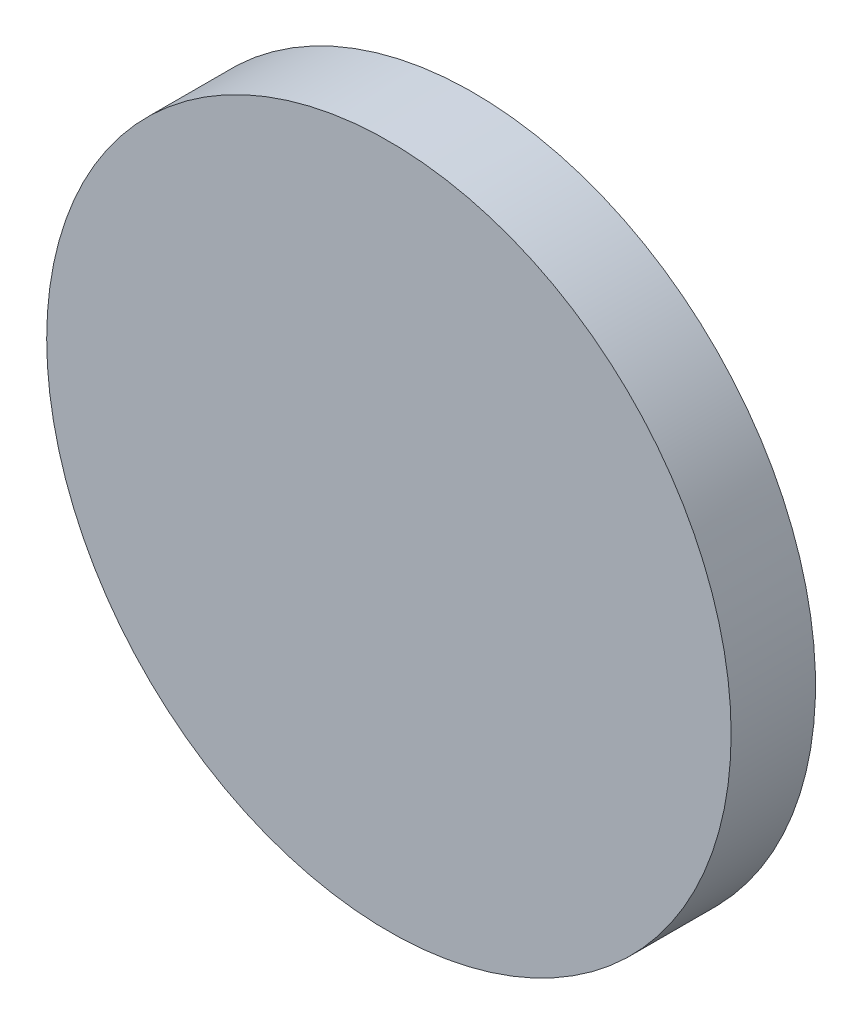
ISO-10303-21;
HEADER;
FILE_DESCRIPTION(('STEP AP214'),'2;1');
FILE_NAME('part.step','',(''),(''),'','','');
FILE_SCHEMA(('AUTOMOTIVE_DESIGN { 1 0 10303 214 1 1 1 1 }'));
ENDSEC;
DATA;
#1=APPLICATION_CONTEXT('core data for automotive mechanical design processes');
#2=APPLICATION_PROTOCOL_DEFINITION('international standard','automotive_design',2000,#1);
#3=PRODUCT_CONTEXT('',#1,'mechanical');
#4=PRODUCT('Part','Part','',(#3));
#5=PRODUCT_RELATED_PRODUCT_CATEGORY('part','',(#4));
#6=PRODUCT_DEFINITION_FORMATION('','',#4);
#7=PRODUCT_DEFINITION_CONTEXT('part definition',#1,'design');
#8=PRODUCT_DEFINITION('design','',#6,#7);
#9=PRODUCT_DEFINITION_SHAPE('','',#8);
#10=(LENGTH_UNIT() NAMED_UNIT(*) SI_UNIT(.MILLI.,.METRE.));
#11=(NAMED_UNIT(*) PLANE_ANGLE_UNIT() SI_UNIT($,.RADIAN.));
#12=(NAMED_UNIT(*) SI_UNIT($,.STERADIAN.) SOLID_ANGLE_UNIT());
#13=UNCERTAINTY_MEASURE_WITH_UNIT(LENGTH_MEASURE(1.E-05),#10,'distance_accuracy_value','');
#14=(GEOMETRIC_REPRESENTATION_CONTEXT(3) GLOBAL_UNCERTAINTY_ASSIGNED_CONTEXT((#13)) GLOBAL_UNIT_ASSIGNED_CONTEXT((#10,
#11,#12)) REPRESENTATION_CONTEXT('',''));
#15=CARTESIAN_POINT('',(0.,0.,0.));
#16=DIRECTION('',(0.,0.,1.));
#17=DIRECTION('',(1.,0.,0.));
#18=AXIS2_PLACEMENT_3D('',#15,#16,#17);
#19=CARTESIAN_POINT('',(0.,0.,15.));
#20=DIRECTION('',(0.,0.,1.));
#21=DIRECTION('',(1.,0.,0.));
#22=AXIS2_PLACEMENT_3D('',#19,#20,#21);
#23=PLANE('',#22);
#24=CARTESIAN_POINT('',(0.,0.,15.));
#25=DIRECTION('',(0.,0.,1.));
#26=DIRECTION('',(1.,0.,0.));
#27=AXIS2_PLACEMENT_3D('',#24,#25,#26);
#28=CIRCLE('',#27,25.5);
#29=CARTESIAN_POINT('',(25.5,0.,15.));
#30=VERTEX_POINT('',#29);
#31=EDGE_CURVE('E10',#30,#30,#28,.T.);
#32=ORIENTED_EDGE('',*,*,#31,.T.);
#33=EDGE_LOOP('',(#32));
#34=FACE_BOUND('',#33,.T.);
#35=CARTESIAN_POINT('',(0.,0.,15.));
#36=DIRECTION('',(0.,0.,1.));
#37=DIRECTION('',(1.,0.,0.));
#38=AXIS2_PLACEMENT_3D('',#35,#36,#37);
#39=CIRCLE('',#38,29.5);
#40=CARTESIAN_POINT('',(29.5,0.,15.));
#41=VERTEX_POINT('',#40);
#42=EDGE_CURVE('E53',#41,#41,#39,.T.);
#43=ORIENTED_EDGE('',*,*,#42,.F.);
#44=EDGE_LOOP('',(#43));
#45=FACE_BOUND('',#44,.T.);
#46=ADVANCED_FACE('F33',(#34,#45),#23,.F.);
#47=CARTESIAN_POINT('',(0.,0.,15.));
#48=DIRECTION('',(0.,0.,-1.));
#49=DIRECTION('',(-1.,0.,0.));
#50=AXIS2_PLACEMENT_3D('',#47,#48,#49);
#51=CYLINDRICAL_SURFACE('',#50,25.5);
#52=ORIENTED_EDGE('',*,*,#31,.F.);
#53=EDGE_LOOP('',(#52));
#54=FACE_BOUND('',#53,.T.);
#55=CARTESIAN_POINT('',(0.,0.,8.));
#56=DIRECTION('',(0.,0.,-1.));
#57=DIRECTION('',(-1.,0.,0.));
#58=AXIS2_PLACEMENT_3D('',#55,#56,#57);
#59=CIRCLE('',#58,25.5);
#60=CARTESIAN_POINT('',(-25.5,0.,8.));
#61=VERTEX_POINT('',#60);
#62=EDGE_CURVE('E41',#61,#61,#59,.T.);
#63=ORIENTED_EDGE('',*,*,#62,.F.);
#64=EDGE_LOOP('',(#63));
#65=FACE_BOUND('',#64,.T.);
#66=ADVANCED_FACE('F35',(#54,#65),#51,.T.);
#67=CARTESIAN_POINT('',(0.,0.,15.));
#68=DIRECTION('',(0.,0.,-1.));
#69=DIRECTION('',(-1.,0.,0.));
#70=AXIS2_PLACEMENT_3D('',#67,#68,#69);
#71=CYLINDRICAL_SURFACE('',#70,23.5);
#72=CARTESIAN_POINT('',(0.,0.,15.));
#73=DIRECTION('',(0.,0.,1.));
#74=DIRECTION('',(1.,0.,0.));
#75=AXIS2_PLACEMENT_3D('',#72,#73,#74);
#76=CIRCLE('',#75,23.5);
#77=CARTESIAN_POINT('',(23.5,0.,15.));
#78=VERTEX_POINT('',#77);
#79=EDGE_CURVE('E47',#78,#78,#76,.T.);
#80=ORIENTED_EDGE('',*,*,#79,.T.);
#81=EDGE_LOOP('',(#80));
#82=FACE_BOUND('',#81,.T.);
#83=CARTESIAN_POINT('',(0.,0.,8.));
#84=DIRECTION('',(0.,0.,-1.));
#85=DIRECTION('',(-1.,0.,0.));
#86=AXIS2_PLACEMENT_3D('',#83,#84,#85);
#87=CIRCLE('',#86,23.5);
#88=CARTESIAN_POINT('',(-23.5,0.,8.));
#89=VERTEX_POINT('',#88);
#90=EDGE_CURVE('E37',#89,#89,#87,.T.);
#91=ORIENTED_EDGE('',*,*,#90,.T.);
#92=EDGE_LOOP('',(#91));
#93=FACE_BOUND('',#92,.T.);
#94=ADVANCED_FACE('F88',(#82,#93),#71,.F.);
#95=CARTESIAN_POINT('',(0.,0.,8.));
#96=DIRECTION('',(0.,0.,-1.));
#97=DIRECTION('',(-1.,0.,0.));
#98=AXIS2_PLACEMENT_3D('',#95,#96,#97);
#99=PLANE('',#98);
#100=ORIENTED_EDGE('',*,*,#90,.F.);
#101=EDGE_LOOP('',(#100));
#102=FACE_BOUND('',#101,.T.);
#103=ORIENTED_EDGE('',*,*,#62,.T.);
#104=EDGE_LOOP('',(#103));
#105=FACE_BOUND('',#104,.T.);
#106=ADVANCED_FACE('F93',(#102,#105),#99,.T.);
#107=ORIENTED_EDGE('',*,*,#79,.F.);
#108=EDGE_LOOP('',(#107));
#109=FACE_BOUND('',#108,.T.);
#110=ADVANCED_FACE('F82',(#109),#23,.F.);
#111=CARTESIAN_POINT('',(0.,0.,8.));
#112=DIRECTION('',(0.,0.,-1.));
#113=DIRECTION('',(-1.,0.,0.));
#114=AXIS2_PLACEMENT_3D('',#111,#112,#113);
#115=TOROIDAL_SURFACE('',#114,29.5,5.);
#116=CARTESIAN_POINT('',(0.,0.,13.));
#117=DIRECTION('',(0.,0.,-1.));
#118=DIRECTION('',(-1.,0.,0.));
#119=AXIS2_PLACEMENT_3D('',#116,#117,#118);
#120=CIRCLE('',#119,29.5);
#121=CARTESIAN_POINT('',(-29.5,0.,13.));
#122=VERTEX_POINT('',#121);
#123=EDGE_CURVE('E60',#122,#122,#120,.T.);
#124=ORIENTED_EDGE('',*,*,#123,.F.);
#125=EDGE_LOOP('',(#124));
#126=FACE_BOUND('',#125,.T.);
#127=CARTESIAN_POINT('',(0.,0.,8.));
#128=DIRECTION('',(0.,0.,-1.));
#129=DIRECTION('',(-1.,0.,0.));
#130=AXIS2_PLACEMENT_3D('',#127,#128,#129);
#131=CIRCLE('',#130,34.5);
#132=CARTESIAN_POINT('',(-34.5,0.,8.));
#133=VERTEX_POINT('',#132);
#134=EDGE_CURVE('E54',#133,#133,#131,.F.);
#135=ORIENTED_EDGE('',*,*,#134,.F.);
#136=EDGE_LOOP('',(#135));
#137=FACE_BOUND('',#136,.T.);
#138=ADVANCED_FACE('F92',(#126,#137),#115,.F.);
#139=CARTESIAN_POINT('',(0.,0.,15.));
#140=DIRECTION('',(0.,0.,-1.));
#141=DIRECTION('',(-1.,0.,0.));
#142=AXIS2_PLACEMENT_3D('',#139,#140,#141);
#143=CYLINDRICAL_SURFACE('',#142,29.5);
#144=ORIENTED_EDGE('',*,*,#123,.T.);
#145=EDGE_LOOP('',(#144));
#146=FACE_BOUND('',#145,.T.);
#147=ORIENTED_EDGE('',*,*,#42,.T.);
#148=EDGE_LOOP('',(#147));
#149=FACE_BOUND('',#148,.T.);
#150=ADVANCED_FACE('F99',(#146,#149),#143,.F.);
#151=CARTESIAN_POINT('',(0.,0.,8.));
#152=DIRECTION('',(0.,0.,-1.));
#153=DIRECTION('',(-1.,0.,0.));
#154=AXIS2_PLACEMENT_3D('',#151,#152,#153);
#155=PLANE('',#154);
#156=ORIENTED_EDGE('',*,*,#134,.T.);
#157=EDGE_LOOP('',(#156));
#158=FACE_BOUND('',#157,.T.);
#159=CARTESIAN_POINT('',(0.,0.,8.));
#160=DIRECTION('',(0.,0.,-1.));
#161=DIRECTION('',(-1.,0.,0.));
#162=AXIS2_PLACEMENT_3D('',#159,#160,#161);
#163=CIRCLE('',#162,36.5);
#164=CARTESIAN_POINT('',(-36.5,0.,8.));
#165=VERTEX_POINT('',#164);
#166=EDGE_CURVE('E57',#165,#165,#163,.T.);
#167=ORIENTED_EDGE('',*,*,#166,.T.);
#168=EDGE_LOOP('',(#167));
#169=FACE_BOUND('',#168,.T.);
#170=ADVANCED_FACE('F66',(#158,#169),#155,.T.);
#171=CARTESIAN_POINT('',(0.,0.,17.));
#172=DIRECTION('',(0.,0.,1.));
#173=DIRECTION('',(1.,0.,0.));
#174=AXIS2_PLACEMENT_3D('',#171,#172,#173);
#175=PLANE('',#174);
#176=CARTESIAN_POINT('',(0.,0.,17.));
#177=DIRECTION('',(0.,0.,1.));
#178=DIRECTION('',(1.,0.,0.));
#179=AXIS2_PLACEMENT_3D('',#176,#177,#178);
#180=CIRCLE('',#179,36.5);
#181=CARTESIAN_POINT('',(36.5,0.,17.));
#182=VERTEX_POINT('',#181);
#183=EDGE_CURVE('E50',#182,#182,#180,.T.);
#184=ORIENTED_EDGE('',*,*,#183,.T.);
#185=EDGE_LOOP('',(#184));
#186=FACE_BOUND('',#185,.T.);
#187=ADVANCED_FACE('F70',(#186),#175,.T.);
#188=CARTESIAN_POINT('',(0.,0.,17.));
#189=DIRECTION('',(0.,0.,-1.));
#190=DIRECTION('',(-1.,0.,0.));
#191=AXIS2_PLACEMENT_3D('',#188,#189,#190);
#192=CYLINDRICAL_SURFACE('',#191,36.5);
#193=ORIENTED_EDGE('',*,*,#183,.F.);
#194=EDGE_LOOP('',(#193));
#195=FACE_BOUND('',#194,.T.);
#196=ORIENTED_EDGE('',*,*,#166,.F.);
#197=EDGE_LOOP('',(#196));
#198=FACE_BOUND('',#197,.T.);
#199=ADVANCED_FACE('F68',(#195,#198),#192,.T.);
#200=CLOSED_SHELL('',(#46,#66,#94,#106,#110,#138,#150,#170,#187,#199));
#201=MANIFOLD_SOLID_BREP('B2',#200);
#202=ADVANCED_BREP_SHAPE_REPRESENTATION('',(#18,#201),#14);
#203=SHAPE_DEFINITION_REPRESENTATION(#9,#202);
ENDSEC;
END-ISO-10303-21;
